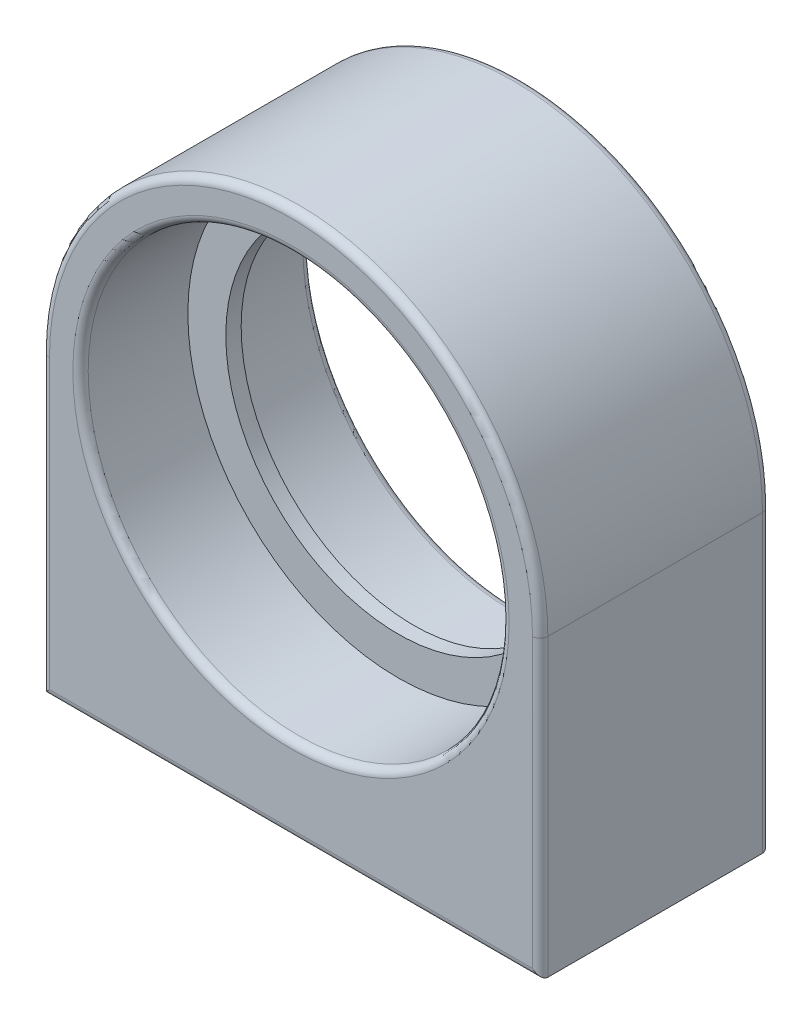
ISO-10303-21;
HEADER;
FILE_DESCRIPTION(('STEP AP214'),'2;1');
FILE_NAME('part.step','',(''),(''),'','','');
FILE_SCHEMA(('AUTOMOTIVE_DESIGN { 1 0 10303 214 1 1 1 1 }'));
ENDSEC;
DATA;
#1=APPLICATION_CONTEXT('core data for automotive mechanical design processes');
#2=APPLICATION_PROTOCOL_DEFINITION('international standard','automotive_design',2000,#1);
#3=PRODUCT_CONTEXT('',#1,'mechanical');
#4=PRODUCT('Part','Part','',(#3));
#5=PRODUCT_RELATED_PRODUCT_CATEGORY('part','',(#4));
#6=PRODUCT_DEFINITION_FORMATION('','',#4);
#7=PRODUCT_DEFINITION_CONTEXT('part definition',#1,'design');
#8=PRODUCT_DEFINITION('design','',#6,#7);
#9=PRODUCT_DEFINITION_SHAPE('','',#8);
#10=(LENGTH_UNIT() NAMED_UNIT(*) SI_UNIT(.MILLI.,.METRE.));
#11=(NAMED_UNIT(*) PLANE_ANGLE_UNIT() SI_UNIT($,.RADIAN.));
#12=(NAMED_UNIT(*) SI_UNIT($,.STERADIAN.) SOLID_ANGLE_UNIT());
#13=UNCERTAINTY_MEASURE_WITH_UNIT(LENGTH_MEASURE(1.E-05),#10,'distance_accuracy_value','');
#14=(GEOMETRIC_REPRESENTATION_CONTEXT(3) GLOBAL_UNCERTAINTY_ASSIGNED_CONTEXT((#13)) GLOBAL_UNIT_ASSIGNED_CONTEXT((#10,
#11,#12)) REPRESENTATION_CONTEXT('',''));
#15=CARTESIAN_POINT('',(0.,0.,0.));
#16=DIRECTION('',(0.,0.,1.));
#17=DIRECTION('',(1.,0.,0.));
#18=AXIS2_PLACEMENT_3D('',#15,#16,#17);
#19=CARTESIAN_POINT('',(0.,19.25,15.));
#20=DIRECTION('',(0.,0.,-1.));
#21=DIRECTION('',(-1.,0.,0.));
#22=AXIS2_PLACEMENT_3D('',#19,#20,#21);
#23=CYLINDRICAL_SURFACE('',#22,22.5);
#24=CARTESIAN_POINT('',(0.,19.25,0.999999999999999));
#25=DIRECTION('',(0.,0.,1.));
#26=DIRECTION('',(1.,0.,0.));
#27=AXIS2_PLACEMENT_3D('',#24,#25,#26);
#28=CIRCLE('',#27,22.5);
#29=CARTESIAN_POINT('',(22.5,19.25,0.999999999999999));
#30=VERTEX_POINT('',#29);
#31=EDGE_CURVE('E231',#30,#30,#28,.T.);
#32=ORIENTED_EDGE('',*,*,#31,.T.);
#33=EDGE_LOOP('',(#32));
#34=FACE_BOUND('',#33,.T.);
#35=CARTESIAN_POINT('',(0.,19.25,-1.));
#36=DIRECTION('',(0.,0.,-1.));
#37=DIRECTION('',(-1.,0.,0.));
#38=AXIS2_PLACEMENT_3D('',#35,#36,#37);
#39=CIRCLE('',#38,22.5);
#40=CARTESIAN_POINT('',(-22.5,19.25,-1.));
#41=VERTEX_POINT('',#40);
#42=EDGE_CURVE('E236',#41,#41,#39,.T.);
#43=ORIENTED_EDGE('',*,*,#42,.T.);
#44=EDGE_LOOP('',(#43));
#45=FACE_BOUND('',#44,.T.);
#46=ADVANCED_FACE('F41',(#34,#45),#23,.F.);
#47=CARTESIAN_POINT('',(0.,19.25,15.));
#48=DIRECTION('',(0.,0.,-1.));
#49=DIRECTION('',(-1.,0.,0.));
#50=AXIS2_PLACEMENT_3D('',#47,#48,#49);
#51=CYLINDRICAL_SURFACE('',#50,32.5);
#52=DIRECTION('',(0.,0.,-1.));
#53=VECTOR('',#52,1.);
#54=CARTESIAN_POINT('',(32.5,19.25,15.));
#55=LINE('',#54,#53);
#56=CARTESIAN_POINT('',(32.5,19.25,14.));
#57=VERTEX_POINT('',#56);
#58=CARTESIAN_POINT('',(32.5,19.25,-14.));
#59=VERTEX_POINT('',#58);
#60=EDGE_CURVE('E234',#57,#59,#55,.T.);
#61=ORIENTED_EDGE('',*,*,#60,.T.);
#62=CARTESIAN_POINT('',(0.,19.25,-14.));
#63=DIRECTION('',(0.,0.,1.));
#64=DIRECTION('',(1.,0.,0.));
#65=AXIS2_PLACEMENT_3D('',#62,#63,#64);
#66=CIRCLE('',#65,32.5);
#67=CARTESIAN_POINT('',(-32.5,19.25,-14.));
#68=VERTEX_POINT('',#67);
#69=EDGE_CURVE('E165',#59,#68,#66,.T.);
#70=ORIENTED_EDGE('',*,*,#69,.T.);
#71=DIRECTION('',(0.,0.,-1.));
#72=VECTOR('',#71,1.);
#73=CARTESIAN_POINT('',(-32.5,19.25,15.));
#74=LINE('',#73,#72);
#75=CARTESIAN_POINT('',(-32.5,19.25,14.));
#76=VERTEX_POINT('',#75);
#77=EDGE_CURVE('E217',#76,#68,#74,.T.);
#78=ORIENTED_EDGE('',*,*,#77,.F.);
#79=CARTESIAN_POINT('',(0.,19.25,14.));
#80=DIRECTION('',(0.,0.,1.));
#81=DIRECTION('',(1.,0.,0.));
#82=AXIS2_PLACEMENT_3D('',#79,#80,#81);
#83=CIRCLE('',#82,32.5);
#84=EDGE_CURVE('E163',#76,#57,#83,.F.);
#85=ORIENTED_EDGE('',*,*,#84,.T.);
#86=EDGE_LOOP('',(#61,#70,#78,#85));
#87=FACE_BOUND('',#86,.T.);
#88=ADVANCED_FACE('F222',(#87),#51,.T.);
#89=CARTESIAN_POINT('',(-32.5,0.,15.));
#90=DIRECTION('',(-1.,0.,0.));
#91=DIRECTION('',(0.,0.,1.));
#92=AXIS2_PLACEMENT_3D('',#89,#90,#91);
#93=PLANE('',#92);
#94=ORIENTED_EDGE('',*,*,#77,.T.);
#95=DIRECTION('',(0.,1.,0.));
#96=VECTOR('',#95,1.);
#97=CARTESIAN_POINT('',(-32.5,-19.25,-14.));
#98=LINE('',#97,#96);
#99=CARTESIAN_POINT('',(-32.5,-19.25,-14.));
#100=VERTEX_POINT('',#99);
#101=EDGE_CURVE('E115',#68,#100,#98,.F.);
#102=ORIENTED_EDGE('',*,*,#101,.T.);
#103=DIRECTION('',(0.,0.,-1.));
#104=VECTOR('',#103,1.);
#105=CARTESIAN_POINT('',(-32.5,-19.25,15.));
#106=LINE('',#105,#104);
#107=CARTESIAN_POINT('',(-32.5,-19.25,14.));
#108=VERTEX_POINT('',#107);
#109=EDGE_CURVE('E219',#108,#100,#106,.T.);
#110=ORIENTED_EDGE('',*,*,#109,.F.);
#111=DIRECTION('',(0.,1.,0.));
#112=VECTOR('',#111,1.);
#113=CARTESIAN_POINT('',(-32.5,0.,14.));
#114=LINE('',#113,#112);
#115=EDGE_CURVE('E135',#108,#76,#114,.T.);
#116=ORIENTED_EDGE('',*,*,#115,.T.);
#117=EDGE_LOOP('',(#94,#102,#110,#116));
#118=FACE_BOUND('',#117,.T.);
#119=ADVANCED_FACE('F216',(#118),#93,.T.);
#120=CARTESIAN_POINT('',(0.,-19.25,15.));
#121=DIRECTION('',(0.,1.,0.));
#122=DIRECTION('',(0.,0.,1.));
#123=AXIS2_PLACEMENT_3D('',#120,#121,#122);
#124=PLANE('',#123);
#125=CARTESIAN_POINT('',(22.5,-19.25,0.));
#126=DIRECTION('',(0.,1.,0.));
#127=DIRECTION('',(0.,0.,1.));
#128=AXIS2_PLACEMENT_3D('',#125,#126,#127);
#129=CIRCLE('',#128,3.8);
#130=CARTESIAN_POINT('',(22.5,-19.25,3.8));
#131=VERTEX_POINT('',#130);
#132=EDGE_CURVE('E151',#131,#131,#129,.T.);
#133=ORIENTED_EDGE('',*,*,#132,.T.);
#134=EDGE_LOOP('',(#133));
#135=FACE_BOUND('',#134,.T.);
#136=CARTESIAN_POINT('',(10.,-19.25,0.));
#137=DIRECTION('',(0.,1.,0.));
#138=DIRECTION('',(0.,0.,1.));
#139=AXIS2_PLACEMENT_3D('',#136,#137,#138);
#140=CIRCLE('',#139,3.8);
#141=CARTESIAN_POINT('',(10.,-19.25,3.8));
#142=VERTEX_POINT('',#141);
#143=EDGE_CURVE('E148',#142,#142,#140,.T.);
#144=ORIENTED_EDGE('',*,*,#143,.T.);
#145=EDGE_LOOP('',(#144));
#146=FACE_BOUND('',#145,.T.);
#147=CARTESIAN_POINT('',(-10.,-19.25,0.));
#148=DIRECTION('',(0.,1.,0.));
#149=DIRECTION('',(0.,0.,1.));
#150=AXIS2_PLACEMENT_3D('',#147,#148,#149);
#151=CIRCLE('',#150,3.8);
#152=CARTESIAN_POINT('',(-10.,-19.25,3.8));
#153=VERTEX_POINT('',#152);
#154=EDGE_CURVE('E145',#153,#153,#151,.T.);
#155=ORIENTED_EDGE('',*,*,#154,.T.);
#156=EDGE_LOOP('',(#155));
#157=FACE_BOUND('',#156,.T.);
#158=CARTESIAN_POINT('',(-22.5,-19.25,0.));
#159=DIRECTION('',(0.,1.,0.));
#160=DIRECTION('',(0.,0.,1.));
#161=AXIS2_PLACEMENT_3D('',#158,#159,#160);
#162=CIRCLE('',#161,3.8);
#163=CARTESIAN_POINT('',(-22.5,-19.25,3.8));
#164=VERTEX_POINT('',#163);
#165=EDGE_CURVE('E142',#164,#164,#162,.T.);
#166=ORIENTED_EDGE('',*,*,#165,.T.);
#167=EDGE_LOOP('',(#166));
#168=FACE_BOUND('',#167,.T.);
#169=ORIENTED_EDGE('',*,*,#109,.T.);
#170=DIRECTION('',(1.,0.,0.));
#171=VECTOR('',#170,1.);
#172=CARTESIAN_POINT('',(0.,-19.25,-14.));
#173=LINE('',#172,#171);
#174=CARTESIAN_POINT('',(32.5,-19.25,-14.));
#175=VERTEX_POINT('',#174);
#176=EDGE_CURVE('E156',#100,#175,#173,.T.);
#177=ORIENTED_EDGE('',*,*,#176,.T.);
#178=DIRECTION('',(0.,0.,-1.));
#179=VECTOR('',#178,1.);
#180=CARTESIAN_POINT('',(32.5,-19.25,15.));
#181=LINE('',#180,#179);
#182=CARTESIAN_POINT('',(32.5,-19.25,14.));
#183=VERTEX_POINT('',#182);
#184=EDGE_CURVE('E227',#183,#175,#181,.T.);
#185=ORIENTED_EDGE('',*,*,#184,.F.);
#186=DIRECTION('',(1.,0.,0.));
#187=VECTOR('',#186,1.);
#188=CARTESIAN_POINT('',(-32.5,-19.25,14.));
#189=LINE('',#188,#187);
#190=EDGE_CURVE('E154',#183,#108,#189,.F.);
#191=ORIENTED_EDGE('',*,*,#190,.T.);
#192=EDGE_LOOP('',(#169,#177,#185,#191));
#193=FACE_BOUND('',#192,.T.);
#194=ADVANCED_FACE('F249',(#135,#146,#157,#168,#193),#124,.F.);
#195=CARTESIAN_POINT('',(32.5,0.,15.));
#196=DIRECTION('',(-1.,0.,0.));
#197=DIRECTION('',(0.,0.,1.));
#198=AXIS2_PLACEMENT_3D('',#195,#196,#197);
#199=PLANE('',#198);
#200=ORIENTED_EDGE('',*,*,#184,.T.);
#201=DIRECTION('',(0.,1.,0.));
#202=VECTOR('',#201,1.);
#203=CARTESIAN_POINT('',(32.5,0.,-14.));
#204=LINE('',#203,#202);
#205=EDGE_CURVE('E161',#175,#59,#204,.T.);
#206=ORIENTED_EDGE('',*,*,#205,.T.);
#207=ORIENTED_EDGE('',*,*,#60,.F.);
#208=DIRECTION('',(0.,1.,0.));
#209=VECTOR('',#208,1.);
#210=CARTESIAN_POINT('',(32.5,-19.25,14.));
#211=LINE('',#210,#209);
#212=EDGE_CURVE('E158',#57,#183,#211,.F.);
#213=ORIENTED_EDGE('',*,*,#212,.T.);
#214=EDGE_LOOP('',(#200,#206,#207,#213));
#215=FACE_BOUND('',#214,.T.);
#216=ADVANCED_FACE('F300',(#215),#199,.F.);
#217=CARTESIAN_POINT('',(0.,0.,15.));
#218=DIRECTION('',(0.,0.,1.));
#219=DIRECTION('',(1.,0.,0.));
#220=AXIS2_PLACEMENT_3D('',#217,#218,#219);
#221=PLANE('',#220);
#222=DIRECTION('',(1.,0.,0.));
#223=VECTOR('',#222,1.);
#224=CARTESIAN_POINT('',(32.5,-18.25,15.));
#225=LINE('',#224,#223);
#226=CARTESIAN_POINT('',(-31.5,-18.25,15.));
#227=VERTEX_POINT('',#226);
#228=CARTESIAN_POINT('',(31.5,-18.25,15.));
#229=VERTEX_POINT('',#228);
#230=EDGE_CURVE('E58',#227,#229,#225,.T.);
#231=ORIENTED_EDGE('',*,*,#230,.T.);
#232=DIRECTION('',(0.,1.,0.));
#233=VECTOR('',#232,1.);
#234=CARTESIAN_POINT('',(31.5,19.25,15.));
#235=LINE('',#234,#233);
#236=CARTESIAN_POINT('',(31.5,19.25,15.));
#237=VERTEX_POINT('',#236);
#238=EDGE_CURVE('E177',#229,#237,#235,.T.);
#239=ORIENTED_EDGE('',*,*,#238,.T.);
#240=CARTESIAN_POINT('',(0.,19.25,15.));
#241=DIRECTION('',(0.,0.,1.));
#242=DIRECTION('',(1.,0.,0.));
#243=AXIS2_PLACEMENT_3D('',#240,#241,#242);
#244=CIRCLE('',#243,31.5);
#245=CARTESIAN_POINT('',(-31.5,19.25,15.));
#246=VERTEX_POINT('',#245);
#247=EDGE_CURVE('E173',#237,#246,#244,.T.);
#248=ORIENTED_EDGE('',*,*,#247,.T.);
#249=DIRECTION('',(0.,1.,0.));
#250=VECTOR('',#249,1.);
#251=CARTESIAN_POINT('',(-31.5,0.,15.));
#252=LINE('',#251,#250);
#253=EDGE_CURVE('E63',#246,#227,#252,.F.);
#254=ORIENTED_EDGE('',*,*,#253,.T.);
#255=EDGE_LOOP('',(#231,#239,#248,#254));
#256=FACE_BOUND('',#255,.T.);
#257=CARTESIAN_POINT('',(0.,19.25,15.));
#258=DIRECTION('',(0.,0.,1.));
#259=DIRECTION('',(1.,0.,0.));
#260=AXIS2_PLACEMENT_3D('',#257,#258,#259);
#261=CIRCLE('',#260,28.45);
#262=CARTESIAN_POINT('',(28.45,19.25,15.));
#263=VERTEX_POINT('',#262);
#264=EDGE_CURVE('E170',#263,#263,#261,.F.);
#265=ORIENTED_EDGE('',*,*,#264,.T.);
#266=EDGE_LOOP('',(#265));
#267=FACE_BOUND('',#266,.T.);
#268=ADVANCED_FACE('F303',(#256,#267),#221,.T.);
#269=CARTESIAN_POINT('',(0.,0.,-15.));
#270=DIRECTION('',(0.,0.,1.));
#271=DIRECTION('',(1.,0.,0.));
#272=AXIS2_PLACEMENT_3D('',#269,#270,#271);
#273=PLANE('',#272);
#274=DIRECTION('',(1.,0.,0.));
#275=VECTOR('',#274,1.);
#276=CARTESIAN_POINT('',(0.,-18.25,-15.));
#277=LINE('',#276,#275);
#278=CARTESIAN_POINT('',(31.5,-18.25,-15.));
#279=VERTEX_POINT('',#278);
#280=CARTESIAN_POINT('',(-31.5,-18.25,-15.));
#281=VERTEX_POINT('',#280);
#282=EDGE_CURVE('E133',#279,#281,#277,.F.);
#283=ORIENTED_EDGE('',*,*,#282,.T.);
#284=DIRECTION('',(0.,1.,0.));
#285=VECTOR('',#284,1.);
#286=CARTESIAN_POINT('',(-31.5,19.25,-15.));
#287=LINE('',#286,#285);
#288=CARTESIAN_POINT('',(-31.5,19.25,-15.));
#289=VERTEX_POINT('',#288);
#290=EDGE_CURVE('E113',#281,#289,#287,.T.);
#291=ORIENTED_EDGE('',*,*,#290,.T.);
#292=CARTESIAN_POINT('',(0.,19.25,-15.));
#293=DIRECTION('',(0.,0.,1.));
#294=DIRECTION('',(1.,0.,0.));
#295=AXIS2_PLACEMENT_3D('',#292,#293,#294);
#296=CIRCLE('',#295,31.5);
#297=CARTESIAN_POINT('',(31.5,19.25,-15.));
#298=VERTEX_POINT('',#297);
#299=EDGE_CURVE('E121',#289,#298,#296,.F.);
#300=ORIENTED_EDGE('',*,*,#299,.T.);
#301=DIRECTION('',(0.,1.,0.));
#302=VECTOR('',#301,1.);
#303=CARTESIAN_POINT('',(31.5,0.,-15.));
#304=LINE('',#303,#302);
#305=EDGE_CURVE('E127',#298,#279,#304,.F.);
#306=ORIENTED_EDGE('',*,*,#305,.T.);
#307=EDGE_LOOP('',(#283,#291,#300,#306));
#308=FACE_BOUND('',#307,.T.);
#309=CARTESIAN_POINT('',(0.,19.25,-15.));
#310=DIRECTION('',(0.,0.,1.));
#311=DIRECTION('',(1.,0.,0.));
#312=AXIS2_PLACEMENT_3D('',#309,#310,#311);
#313=CIRCLE('',#312,28.45);
#314=CARTESIAN_POINT('',(28.45,19.25,-15.));
#315=VERTEX_POINT('',#314);
#316=EDGE_CURVE('E128',#315,#315,#313,.T.);
#317=ORIENTED_EDGE('',*,*,#316,.T.);
#318=EDGE_LOOP('',(#317));
#319=FACE_BOUND('',#318,.T.);
#320=ADVANCED_FACE('F130',(#308,#319),#273,.F.);
#321=CARTESIAN_POINT('',(0.,19.25,0.999999999999999));
#322=DIRECTION('',(0.,0.,1.));
#323=DIRECTION('',(1.,0.,0.));
#324=AXIS2_PLACEMENT_3D('',#321,#322,#323);
#325=CYLINDRICAL_SURFACE('',#324,27.45);
#326=CARTESIAN_POINT('',(0.,19.25,14.));
#327=DIRECTION('',(0.,0.,1.));
#328=DIRECTION('',(1.,0.,0.));
#329=AXIS2_PLACEMENT_3D('',#326,#327,#328);
#330=CIRCLE('',#329,27.45);
#331=CARTESIAN_POINT('',(27.45,19.25,14.));
#332=VERTEX_POINT('',#331);
#333=EDGE_CURVE('E179',#332,#332,#330,.T.);
#334=ORIENTED_EDGE('',*,*,#333,.T.);
#335=EDGE_LOOP('',(#334));
#336=FACE_BOUND('',#335,.T.);
#337=CARTESIAN_POINT('',(0.,19.25,0.999999999999999));
#338=DIRECTION('',(0.,0.,1.));
#339=DIRECTION('',(1.,0.,0.));
#340=AXIS2_PLACEMENT_3D('',#337,#338,#339);
#341=CIRCLE('',#340,27.45);
#342=CARTESIAN_POINT('',(27.45,19.25,0.999999999999999));
#343=VERTEX_POINT('',#342);
#344=EDGE_CURVE('E235',#343,#343,#341,.T.);
#345=ORIENTED_EDGE('',*,*,#344,.F.);
#346=EDGE_LOOP('',(#345));
#347=FACE_BOUND('',#346,.T.);
#348=ADVANCED_FACE('F383',(#336,#347),#325,.F.);
#349=CARTESIAN_POINT('',(0.,19.25,0.999999999999999));
#350=DIRECTION('',(0.,0.,1.));
#351=DIRECTION('',(1.,0.,0.));
#352=AXIS2_PLACEMENT_3D('',#349,#350,#351);
#353=PLANE('',#352);
#354=ORIENTED_EDGE('',*,*,#31,.F.);
#355=EDGE_LOOP('',(#354));
#356=FACE_BOUND('',#355,.T.);
#357=ORIENTED_EDGE('',*,*,#344,.T.);
#358=EDGE_LOOP('',(#357));
#359=FACE_BOUND('',#358,.T.);
#360=ADVANCED_FACE('F380',(#356,#359),#353,.T.);
#361=CARTESIAN_POINT('',(0.,19.25,-0.999999999999999));
#362=DIRECTION('',(0.,0.,-1.));
#363=DIRECTION('',(-1.,0.,0.));
#364=AXIS2_PLACEMENT_3D('',#361,#362,#363);
#365=CYLINDRICAL_SURFACE('',#364,27.45);
#366=CARTESIAN_POINT('',(0.,19.25,-14.));
#367=DIRECTION('',(0.,0.,1.));
#368=DIRECTION('',(1.,0.,0.));
#369=AXIS2_PLACEMENT_3D('',#366,#367,#368);
#370=CIRCLE('',#369,27.45);
#371=CARTESIAN_POINT('',(27.45,19.25,-14.));
#372=VERTEX_POINT('',#371);
#373=EDGE_CURVE('E167',#372,#372,#370,.F.);
#374=ORIENTED_EDGE('',*,*,#373,.T.);
#375=EDGE_LOOP('',(#374));
#376=FACE_BOUND('',#375,.T.);
#377=CARTESIAN_POINT('',(0.,19.25,-0.999999999999999));
#378=DIRECTION('',(0.,0.,1.));
#379=DIRECTION('',(1.,0.,0.));
#380=AXIS2_PLACEMENT_3D('',#377,#378,#379);
#381=CIRCLE('',#380,27.45);
#382=CARTESIAN_POINT('',(27.45,19.25,-0.999999999999999));
#383=VERTEX_POINT('',#382);
#384=EDGE_CURVE('E238',#383,#383,#381,.T.);
#385=ORIENTED_EDGE('',*,*,#384,.T.);
#386=EDGE_LOOP('',(#385));
#387=FACE_BOUND('',#386,.T.);
#388=ADVANCED_FACE('F376',(#376,#387),#365,.F.);
#389=CARTESIAN_POINT('',(0.,19.25,-0.999999999999999));
#390=DIRECTION('',(0.,0.,-1.));
#391=DIRECTION('',(1.,0.,0.));
#392=AXIS2_PLACEMENT_3D('',#389,#390,#391);
#393=PLANE('',#392);
#394=ORIENTED_EDGE('',*,*,#42,.F.);
#395=EDGE_LOOP('',(#394));
#396=FACE_BOUND('',#395,.T.);
#397=ORIENTED_EDGE('',*,*,#384,.F.);
#398=EDGE_LOOP('',(#397));
#399=FACE_BOUND('',#398,.T.);
#400=ADVANCED_FACE('F370',(#396,#399),#393,.T.);
#401=CARTESIAN_POINT('',(22.5,-8.25,0.));
#402=DIRECTION('',(0.,-1.,0.));
#403=DIRECTION('',(0.,0.,-1.));
#404=AXIS2_PLACEMENT_3D('',#401,#402,#403);
#405=CYLINDRICAL_SURFACE('',#404,2.8);
#406=CARTESIAN_POINT('',(22.5,-18.25,0.));
#407=DIRECTION('',(0.,1.,0.));
#408=DIRECTION('',(0.,0.,1.));
#409=AXIS2_PLACEMENT_3D('',#406,#407,#408);
#410=CIRCLE('',#409,2.8);
#411=CARTESIAN_POINT('',(22.5,-18.25,2.8));
#412=VERTEX_POINT('',#411);
#413=EDGE_CURVE('E182',#412,#412,#410,.F.);
#414=ORIENTED_EDGE('',*,*,#413,.T.);
#415=EDGE_LOOP('',(#414));
#416=FACE_BOUND('',#415,.T.);
#417=CARTESIAN_POINT('',(22.5,-8.25,0.));
#418=DIRECTION('',(0.,-1.,0.));
#419=DIRECTION('',(0.,0.,1.));
#420=AXIS2_PLACEMENT_3D('',#417,#418,#419);
#421=CIRCLE('',#420,2.8);
#422=CARTESIAN_POINT('',(22.5,-8.25,2.8));
#423=VERTEX_POINT('',#422);
#424=EDGE_CURVE('E195',#423,#423,#421,.T.);
#425=ORIENTED_EDGE('',*,*,#424,.F.);
#426=EDGE_LOOP('',(#425));
#427=FACE_BOUND('',#426,.T.);
#428=ADVANCED_FACE('F367',(#416,#427),#405,.F.);
#429=CARTESIAN_POINT('',(22.5,-8.25,0.));
#430=DIRECTION('',(0.,1.,0.));
#431=DIRECTION('',(0.,0.,1.));
#432=AXIS2_PLACEMENT_3D('',#429,#430,#431);
#433=PLANE('',#432);
#434=ORIENTED_EDGE('',*,*,#424,.T.);
#435=EDGE_LOOP('',(#434));
#436=FACE_BOUND('',#435,.T.);
#437=ADVANCED_FACE('F364',(#436),#433,.F.);
#438=CARTESIAN_POINT('',(10.,-8.25,0.));
#439=DIRECTION('',(0.,-1.,0.));
#440=DIRECTION('',(0.,0.,-1.));
#441=AXIS2_PLACEMENT_3D('',#438,#439,#440);
#442=CYLINDRICAL_SURFACE('',#441,2.8);
#443=CARTESIAN_POINT('',(10.,-18.25,0.));
#444=DIRECTION('',(0.,1.,0.));
#445=DIRECTION('',(0.,0.,1.));
#446=AXIS2_PLACEMENT_3D('',#443,#444,#445);
#447=CIRCLE('',#446,2.8);
#448=CARTESIAN_POINT('',(10.,-18.25,2.8));
#449=VERTEX_POINT('',#448);
#450=EDGE_CURVE('E185',#449,#449,#447,.F.);
#451=ORIENTED_EDGE('',*,*,#450,.T.);
#452=EDGE_LOOP('',(#451));
#453=FACE_BOUND('',#452,.T.);
#454=CARTESIAN_POINT('',(10.,-8.25,0.));
#455=DIRECTION('',(0.,-1.,0.));
#456=DIRECTION('',(0.,0.,1.));
#457=AXIS2_PLACEMENT_3D('',#454,#455,#456);
#458=CIRCLE('',#457,2.8);
#459=CARTESIAN_POINT('',(10.,-8.25,2.8));
#460=VERTEX_POINT('',#459);
#461=EDGE_CURVE('E260',#460,#460,#458,.T.);
#462=ORIENTED_EDGE('',*,*,#461,.F.);
#463=EDGE_LOOP('',(#462));
#464=FACE_BOUND('',#463,.T.);
#465=ADVANCED_FACE('F360',(#453,#464),#442,.F.);
#466=CARTESIAN_POINT('',(10.,-8.25,0.));
#467=DIRECTION('',(0.,1.,0.));
#468=DIRECTION('',(0.,0.,1.));
#469=AXIS2_PLACEMENT_3D('',#466,#467,#468);
#470=PLANE('',#469);
#471=ORIENTED_EDGE('',*,*,#461,.T.);
#472=EDGE_LOOP('',(#471));
#473=FACE_BOUND('',#472,.T.);
#474=ADVANCED_FACE('F354',(#473),#470,.F.);
#475=CARTESIAN_POINT('',(-10.,-8.25,0.));
#476=DIRECTION('',(0.,-1.,0.));
#477=DIRECTION('',(0.,0.,-1.));
#478=AXIS2_PLACEMENT_3D('',#475,#476,#477);
#479=CYLINDRICAL_SURFACE('',#478,2.8);
#480=CARTESIAN_POINT('',(-10.,-18.25,0.));
#481=DIRECTION('',(0.,1.,0.));
#482=DIRECTION('',(0.,0.,1.));
#483=AXIS2_PLACEMENT_3D('',#480,#481,#482);
#484=CIRCLE('',#483,2.8);
#485=CARTESIAN_POINT('',(-10.,-18.25,2.8));
#486=VERTEX_POINT('',#485);
#487=EDGE_CURVE('E50',#486,#486,#484,.F.);
#488=ORIENTED_EDGE('',*,*,#487,.T.);
#489=EDGE_LOOP('',(#488));
#490=FACE_BOUND('',#489,.T.);
#491=CARTESIAN_POINT('',(-10.,-8.25,0.));
#492=DIRECTION('',(0.,-1.,0.));
#493=DIRECTION('',(0.,0.,-1.));
#494=AXIS2_PLACEMENT_3D('',#491,#492,#493);
#495=CIRCLE('',#494,2.8);
#496=CARTESIAN_POINT('',(-10.,-8.25,-2.8));
#497=VERTEX_POINT('',#496);
#498=EDGE_CURVE('E263',#497,#497,#495,.T.);
#499=ORIENTED_EDGE('',*,*,#498,.F.);
#500=EDGE_LOOP('',(#499));
#501=FACE_BOUND('',#500,.T.);
#502=ADVANCED_FACE('F283',(#490,#501),#479,.F.);
#503=CARTESIAN_POINT('',(-10.,-8.25,0.));
#504=DIRECTION('',(0.,-1.,0.));
#505=DIRECTION('',(0.,0.,-1.));
#506=AXIS2_PLACEMENT_3D('',#503,#504,#505);
#507=PLANE('',#506);
#508=ORIENTED_EDGE('',*,*,#498,.T.);
#509=EDGE_LOOP('',(#508));
#510=FACE_BOUND('',#509,.T.);
#511=ADVANCED_FACE('F273',(#510),#507,.T.);
#512=CARTESIAN_POINT('',(-22.5,-8.25,0.));
#513=DIRECTION('',(0.,-1.,0.));
#514=DIRECTION('',(0.,0.,-1.));
#515=AXIS2_PLACEMENT_3D('',#512,#513,#514);
#516=CYLINDRICAL_SURFACE('',#515,2.8);
#517=CARTESIAN_POINT('',(-22.5,-18.25,0.));
#518=DIRECTION('',(0.,1.,0.));
#519=DIRECTION('',(0.,0.,1.));
#520=AXIS2_PLACEMENT_3D('',#517,#518,#519);
#521=CIRCLE('',#520,2.8);
#522=CARTESIAN_POINT('',(-22.5,-18.25,2.8));
#523=VERTEX_POINT('',#522);
#524=EDGE_CURVE('E11',#523,#523,#521,.F.);
#525=ORIENTED_EDGE('',*,*,#524,.T.);
#526=EDGE_LOOP('',(#525));
#527=FACE_BOUND('',#526,.T.);
#528=CARTESIAN_POINT('',(-22.5,-8.25,0.));
#529=DIRECTION('',(0.,-1.,0.));
#530=DIRECTION('',(0.,0.,-1.));
#531=AXIS2_PLACEMENT_3D('',#528,#529,#530);
#532=CIRCLE('',#531,2.8);
#533=CARTESIAN_POINT('',(-22.5,-8.25,-2.8));
#534=VERTEX_POINT('',#533);
#535=EDGE_CURVE('E257',#534,#534,#532,.T.);
#536=ORIENTED_EDGE('',*,*,#535,.F.);
#537=EDGE_LOOP('',(#536));
#538=FACE_BOUND('',#537,.T.);
#539=ADVANCED_FACE('F271',(#527,#538),#516,.F.);
#540=CARTESIAN_POINT('',(-22.5,-8.25,0.));
#541=DIRECTION('',(0.,-1.,0.));
#542=DIRECTION('',(0.,0.,-1.));
#543=AXIS2_PLACEMENT_3D('',#540,#541,#542);
#544=PLANE('',#543);
#545=ORIENTED_EDGE('',*,*,#535,.T.);
#546=EDGE_LOOP('',(#545));
#547=FACE_BOUND('',#546,.T.);
#548=ADVANCED_FACE('F269',(#547),#544,.T.);
#549=CARTESIAN_POINT('',(31.5,0.,-14.));
#550=DIRECTION('',(0.,1.,0.));
#551=DIRECTION('',(0.,0.,1.));
#552=AXIS2_PLACEMENT_3D('',#549,#550,#551);
#553=CYLINDRICAL_SURFACE('',#552,1.);
#554=CARTESIAN_POINT('',(31.5,19.25,-14.));
#555=DIRECTION('',(0.,1.,0.));
#556=DIRECTION('',(0.,0.,1.));
#557=AXIS2_PLACEMENT_3D('',#554,#555,#556);
#558=CIRCLE('',#557,1.);
#559=EDGE_CURVE('E124',#59,#298,#558,.T.);
#560=ORIENTED_EDGE('',*,*,#559,.F.);
#561=ORIENTED_EDGE('',*,*,#205,.F.);
#562=CARTESIAN_POINT('',(31.5,-18.25,-14.));
#563=DIRECTION('',(0.707106781186547,0.707106781186547,0.));
#564=DIRECTION('',(-0.707106781186547,0.707106781186547,0.));
#565=AXIS2_PLACEMENT_3D('',#562,#563,#564);
#566=ELLIPSE('',#565,1.41421356237309,1.);
#567=EDGE_CURVE('E192',#279,#175,#566,.F.);
#568=ORIENTED_EDGE('',*,*,#567,.F.);
#569=ORIENTED_EDGE('',*,*,#305,.F.);
#570=EDGE_LOOP('',(#560,#561,#568,#569));
#571=FACE_BOUND('',#570,.T.);
#572=ADVANCED_FACE('F242',(#571),#553,.T.);
#573=CARTESIAN_POINT('',(0.,-18.25,-14.));
#574=DIRECTION('',(1.,0.,0.));
#575=DIRECTION('',(0.,0.,-1.));
#576=AXIS2_PLACEMENT_3D('',#573,#574,#575);
#577=CYLINDRICAL_SURFACE('',#576,1.);
#578=ORIENTED_EDGE('',*,*,#567,.T.);
#579=ORIENTED_EDGE('',*,*,#176,.F.);
#580=CARTESIAN_POINT('',(-31.5,-18.25,-14.));
#581=DIRECTION('',(0.707106781186547,-0.707106781186547,0.));
#582=DIRECTION('',(0.707106781186547,0.707106781186547,0.));
#583=AXIS2_PLACEMENT_3D('',#580,#581,#582);
#584=ELLIPSE('',#583,1.41421356237309,1.);
#585=EDGE_CURVE('E118',#281,#100,#584,.F.);
#586=ORIENTED_EDGE('',*,*,#585,.F.);
#587=ORIENTED_EDGE('',*,*,#282,.F.);
#588=EDGE_LOOP('',(#578,#579,#586,#587));
#589=FACE_BOUND('',#588,.T.);
#590=ADVANCED_FACE('F245',(#589),#577,.T.);
#591=CARTESIAN_POINT('',(0.,19.25,-14.));
#592=DIRECTION('',(0.,0.,1.));
#593=DIRECTION('',(1.,0.,0.));
#594=AXIS2_PLACEMENT_3D('',#591,#592,#593);
#595=TOROIDAL_SURFACE('',#594,31.5,1.);
#596=ORIENTED_EDGE('',*,*,#559,.T.);
#597=ORIENTED_EDGE('',*,*,#299,.F.);
#598=CARTESIAN_POINT('',(-31.5,19.25,-14.));
#599=DIRECTION('',(0.,-1.,0.));
#600=DIRECTION('',(0.,0.,-1.));
#601=AXIS2_PLACEMENT_3D('',#598,#599,#600);
#602=CIRCLE('',#601,1.);
#603=EDGE_CURVE('E109',#68,#289,#602,.T.);
#604=ORIENTED_EDGE('',*,*,#603,.F.);
#605=ORIENTED_EDGE('',*,*,#69,.F.);
#606=EDGE_LOOP('',(#596,#597,#604,#605));
#607=FACE_BOUND('',#606,.T.);
#608=ADVANCED_FACE('F122',(#607),#595,.T.);
#609=CARTESIAN_POINT('',(-31.5,0.,-14.));
#610=DIRECTION('',(0.,-1.,0.));
#611=DIRECTION('',(0.,0.,-1.));
#612=AXIS2_PLACEMENT_3D('',#609,#610,#611);
#613=CYLINDRICAL_SURFACE('',#612,1.);
#614=ORIENTED_EDGE('',*,*,#585,.T.);
#615=ORIENTED_EDGE('',*,*,#101,.F.);
#616=ORIENTED_EDGE('',*,*,#603,.T.);
#617=ORIENTED_EDGE('',*,*,#290,.F.);
#618=EDGE_LOOP('',(#614,#615,#616,#617));
#619=FACE_BOUND('',#618,.T.);
#620=ADVANCED_FACE('F111',(#619),#613,.T.);
#621=CARTESIAN_POINT('',(0.,19.25,-14.));
#622=DIRECTION('',(0.,0.,1.));
#623=DIRECTION('',(1.,0.,0.));
#624=AXIS2_PLACEMENT_3D('',#621,#622,#623);
#625=TOROIDAL_SURFACE('',#624,28.45,1.);
#626=ORIENTED_EDGE('',*,*,#373,.F.);
#627=EDGE_LOOP('',(#626));
#628=FACE_BOUND('',#627,.T.);
#629=ORIENTED_EDGE('',*,*,#316,.F.);
#630=EDGE_LOOP('',(#629));
#631=FACE_BOUND('',#630,.T.);
#632=ADVANCED_FACE('F311',(#628,#631),#625,.T.);
#633=CARTESIAN_POINT('',(-31.5,0.,14.));
#634=DIRECTION('',(0.,1.,0.));
#635=DIRECTION('',(0.,0.,1.));
#636=AXIS2_PLACEMENT_3D('',#633,#634,#635);
#637=CYLINDRICAL_SURFACE('',#636,1.);
#638=CARTESIAN_POINT('',(-31.5,19.25,14.));
#639=DIRECTION('',(0.,1.,0.));
#640=DIRECTION('',(0.,0.,1.));
#641=AXIS2_PLACEMENT_3D('',#638,#639,#640);
#642=CIRCLE('',#641,1.);
#643=EDGE_CURVE('E199',#76,#246,#642,.T.);
#644=ORIENTED_EDGE('',*,*,#643,.F.);
#645=ORIENTED_EDGE('',*,*,#115,.F.);
#646=CARTESIAN_POINT('',(-31.5,-18.25,14.));
#647=DIRECTION('',(-0.707106781186547,0.707106781186547,0.));
#648=DIRECTION('',(0.707106781186547,0.707106781186547,0.));
#649=AXIS2_PLACEMENT_3D('',#646,#647,#648);
#650=ELLIPSE('',#649,1.41421356237309,1.);
#651=EDGE_CURVE('E45',#227,#108,#650,.F.);
#652=ORIENTED_EDGE('',*,*,#651,.F.);
#653=ORIENTED_EDGE('',*,*,#253,.F.);
#654=EDGE_LOOP('',(#644,#645,#652,#653));
#655=FACE_BOUND('',#654,.T.);
#656=ADVANCED_FACE('F211',(#655),#637,.T.);
#657=CARTESIAN_POINT('',(0.,-18.25,14.));
#658=DIRECTION('',(-1.,0.,0.));
#659=DIRECTION('',(0.,0.,1.));
#660=AXIS2_PLACEMENT_3D('',#657,#658,#659);
#661=CYLINDRICAL_SURFACE('',#660,1.);
#662=ORIENTED_EDGE('',*,*,#651,.T.);
#663=ORIENTED_EDGE('',*,*,#190,.F.);
#664=CARTESIAN_POINT('',(31.5,-18.25,14.));
#665=DIRECTION('',(-0.707106781186547,-0.707106781186547,0.));
#666=DIRECTION('',(-0.707106781186547,0.707106781186547,0.));
#667=AXIS2_PLACEMENT_3D('',#664,#665,#666);
#668=ELLIPSE('',#667,1.41421356237309,1.);
#669=EDGE_CURVE('E198',#229,#183,#668,.F.);
#670=ORIENTED_EDGE('',*,*,#669,.F.);
#671=ORIENTED_EDGE('',*,*,#230,.F.);
#672=EDGE_LOOP('',(#662,#663,#670,#671));
#673=FACE_BOUND('',#672,.T.);
#674=ADVANCED_FACE('F208',(#673),#661,.T.);
#675=CARTESIAN_POINT('',(0.,19.25,14.));
#676=DIRECTION('',(0.,0.,1.));
#677=DIRECTION('',(1.,0.,0.));
#678=AXIS2_PLACEMENT_3D('',#675,#676,#677);
#679=TOROIDAL_SURFACE('',#678,31.5,1.);
#680=ORIENTED_EDGE('',*,*,#643,.T.);
#681=ORIENTED_EDGE('',*,*,#247,.F.);
#682=CARTESIAN_POINT('',(31.5,19.25,14.));
#683=DIRECTION('',(0.,-1.,0.));
#684=DIRECTION('',(0.,0.,-1.));
#685=AXIS2_PLACEMENT_3D('',#682,#683,#684);
#686=CIRCLE('',#685,1.);
#687=EDGE_CURVE('E196',#57,#237,#686,.T.);
#688=ORIENTED_EDGE('',*,*,#687,.F.);
#689=ORIENTED_EDGE('',*,*,#84,.F.);
#690=EDGE_LOOP('',(#680,#681,#688,#689));
#691=FACE_BOUND('',#690,.T.);
#692=ADVANCED_FACE('F324',(#691),#679,.T.);
#693=CARTESIAN_POINT('',(31.5,0.,14.));
#694=DIRECTION('',(0.,-1.,0.));
#695=DIRECTION('',(0.,0.,-1.));
#696=AXIS2_PLACEMENT_3D('',#693,#694,#695);
#697=CYLINDRICAL_SURFACE('',#696,1.);
#698=ORIENTED_EDGE('',*,*,#669,.T.);
#699=ORIENTED_EDGE('',*,*,#212,.F.);
#700=ORIENTED_EDGE('',*,*,#687,.T.);
#701=ORIENTED_EDGE('',*,*,#238,.F.);
#702=EDGE_LOOP('',(#698,#699,#700,#701));
#703=FACE_BOUND('',#702,.T.);
#704=ADVANCED_FACE('F320',(#703),#697,.T.);
#705=CARTESIAN_POINT('',(0.,19.25,14.));
#706=DIRECTION('',(0.,0.,1.));
#707=DIRECTION('',(1.,0.,0.));
#708=AXIS2_PLACEMENT_3D('',#705,#706,#707);
#709=TOROIDAL_SURFACE('',#708,28.45,1.);
#710=ORIENTED_EDGE('',*,*,#264,.F.);
#711=EDGE_LOOP('',(#710));
#712=FACE_BOUND('',#711,.T.);
#713=ORIENTED_EDGE('',*,*,#333,.F.);
#714=EDGE_LOOP('',(#713));
#715=FACE_BOUND('',#714,.T.);
#716=ADVANCED_FACE('F323',(#712,#715),#709,.T.);
#717=CARTESIAN_POINT('',(22.5,-18.25,0.));
#718=DIRECTION('',(0.,1.,0.));
#719=DIRECTION('',(0.,0.,1.));
#720=AXIS2_PLACEMENT_3D('',#717,#718,#719);
#721=TOROIDAL_SURFACE('',#720,3.8,1.);
#722=ORIENTED_EDGE('',*,*,#132,.F.);
#723=EDGE_LOOP('',(#722));
#724=FACE_BOUND('',#723,.T.);
#725=ORIENTED_EDGE('',*,*,#413,.F.);
#726=EDGE_LOOP('',(#725));
#727=FACE_BOUND('',#726,.T.);
#728=ADVANCED_FACE('F334',(#724,#727),#721,.T.);
#729=CARTESIAN_POINT('',(10.,-18.25,0.));
#730=DIRECTION('',(0.,1.,0.));
#731=DIRECTION('',(0.,0.,1.));
#732=AXIS2_PLACEMENT_3D('',#729,#730,#731);
#733=TOROIDAL_SURFACE('',#732,3.8,1.);
#734=ORIENTED_EDGE('',*,*,#143,.F.);
#735=EDGE_LOOP('',(#734));
#736=FACE_BOUND('',#735,.T.);
#737=ORIENTED_EDGE('',*,*,#450,.F.);
#738=EDGE_LOOP('',(#737));
#739=FACE_BOUND('',#738,.T.);
#740=ADVANCED_FACE('F338',(#736,#739),#733,.T.);
#741=CARTESIAN_POINT('',(-10.,-18.25,0.));
#742=DIRECTION('',(0.,1.,0.));
#743=DIRECTION('',(0.,0.,1.));
#744=AXIS2_PLACEMENT_3D('',#741,#742,#743);
#745=TOROIDAL_SURFACE('',#744,3.8,1.);
#746=ORIENTED_EDGE('',*,*,#154,.F.);
#747=EDGE_LOOP('',(#746));
#748=FACE_BOUND('',#747,.T.);
#749=ORIENTED_EDGE('',*,*,#487,.F.);
#750=EDGE_LOOP('',(#749));
#751=FACE_BOUND('',#750,.T.);
#752=ADVANCED_FACE('F341',(#748,#751),#745,.T.);
#753=CARTESIAN_POINT('',(-22.5,-18.25,0.));
#754=DIRECTION('',(0.,1.,0.));
#755=DIRECTION('',(0.,0.,1.));
#756=AXIS2_PLACEMENT_3D('',#753,#754,#755);
#757=TOROIDAL_SURFACE('',#756,3.8,1.);
#758=ORIENTED_EDGE('',*,*,#165,.F.);
#759=EDGE_LOOP('',(#758));
#760=FACE_BOUND('',#759,.T.);
#761=ORIENTED_EDGE('',*,*,#524,.F.);
#762=EDGE_LOOP('',(#761));
#763=FACE_BOUND('',#762,.T.);
#764=ADVANCED_FACE('F43',(#760,#763),#757,.T.);
#765=CLOSED_SHELL('',(#46,#88,#119,#194,#216,#268,#320,#348,#360,#388,#400,#428,#437,#465,#474,
#502,#511,#539,#548,#572,#590,#608,#620,#632,#656,#674,#692,#704,#716,#728,#740,#752,#764));
#766=MANIFOLD_SOLID_BREP('B2',#765);
#767=ADVANCED_BREP_SHAPE_REPRESENTATION('',(#18,#766),#14);
#768=SHAPE_DEFINITION_REPRESENTATION(#9,#767);
ENDSEC;
END-ISO-10303-21;
